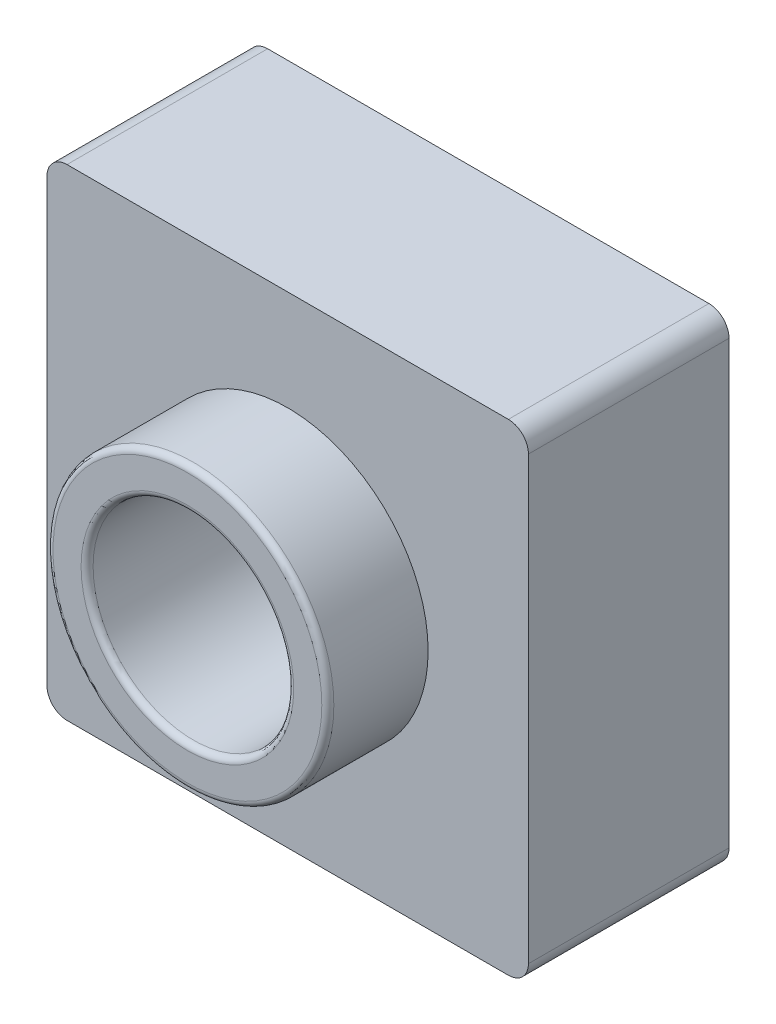
ISO-10303-21;
HEADER;
FILE_DESCRIPTION(('STEP AP214'),'2;1');
FILE_NAME('part.step','',(''),(''),'','','');
FILE_SCHEMA(('AUTOMOTIVE_DESIGN { 1 0 10303 214 1 1 1 1 }'));
ENDSEC;
DATA;
#1=APPLICATION_CONTEXT('core data for automotive mechanical design processes');
#2=APPLICATION_PROTOCOL_DEFINITION('international standard','automotive_design',2000,#1);
#3=PRODUCT_CONTEXT('',#1,'mechanical');
#4=PRODUCT('Part','Part','',(#3));
#5=PRODUCT_RELATED_PRODUCT_CATEGORY('part','',(#4));
#6=PRODUCT_DEFINITION_FORMATION('','',#4);
#7=PRODUCT_DEFINITION_CONTEXT('part definition',#1,'design');
#8=PRODUCT_DEFINITION('design','',#6,#7);
#9=PRODUCT_DEFINITION_SHAPE('','',#8);
#10=(LENGTH_UNIT() NAMED_UNIT(*) SI_UNIT(.MILLI.,.METRE.));
#11=(NAMED_UNIT(*) PLANE_ANGLE_UNIT() SI_UNIT($,.RADIAN.));
#12=(NAMED_UNIT(*) SI_UNIT($,.STERADIAN.) SOLID_ANGLE_UNIT());
#13=UNCERTAINTY_MEASURE_WITH_UNIT(LENGTH_MEASURE(1.E-05),#10,'distance_accuracy_value','');
#14=(GEOMETRIC_REPRESENTATION_CONTEXT(3) GLOBAL_UNCERTAINTY_ASSIGNED_CONTEXT((#13)) GLOBAL_UNIT_ASSIGNED_CONTEXT((#10,
#11,#12)) REPRESENTATION_CONTEXT('',''));
#15=CARTESIAN_POINT('',(0.,0.,0.));
#16=DIRECTION('',(0.,0.,1.));
#17=DIRECTION('',(1.,0.,0.));
#18=AXIS2_PLACEMENT_3D('',#15,#16,#17);
#19=CARTESIAN_POINT('',(-202.772277227723,101.386138613861,50.));
#20=DIRECTION('',(1.,0.,0.));
#21=DIRECTION('',(0.,1.,0.));
#22=AXIS2_PLACEMENT_3D('',#19,#20,#21);
#23=PLANE('',#22);
#24=DIRECTION('',(0.,-1.,0.));
#25=VECTOR('',#24,1.);
#26=CARTESIAN_POINT('',(-202.772277227723,101.386138613861,0.));
#27=LINE('',#26,#25);
#28=CARTESIAN_POINT('',(-202.772277227723,96.3861386138614,0.));
#29=VERTEX_POINT('',#28);
#30=CARTESIAN_POINT('',(-202.772277227723,-13.6138613861386,0.));
#31=VERTEX_POINT('',#30);
#32=EDGE_CURVE('E125',#29,#31,#27,.T.);
#33=ORIENTED_EDGE('',*,*,#32,.T.);
#34=DIRECTION('',(0.,0.,-1.));
#35=VECTOR('',#34,1.);
#36=CARTESIAN_POINT('',(-202.772277227723,-13.6138613861386,50.));
#37=LINE('',#36,#35);
#38=CARTESIAN_POINT('',(-202.772277227723,-13.6138613861386,50.));
#39=VERTEX_POINT('',#38);
#40=EDGE_CURVE('E103',#31,#39,#37,.F.);
#41=ORIENTED_EDGE('',*,*,#40,.T.);
#42=DIRECTION('',(0.,-1.,0.));
#43=VECTOR('',#42,1.);
#44=CARTESIAN_POINT('',(-202.772277227723,101.386138613861,50.));
#45=LINE('',#44,#43);
#46=CARTESIAN_POINT('',(-202.772277227723,96.3861386138614,50.));
#47=VERTEX_POINT('',#46);
#48=EDGE_CURVE('E135',#47,#39,#45,.T.);
#49=ORIENTED_EDGE('',*,*,#48,.F.);
#50=DIRECTION('',(0.,0.,-1.));
#51=VECTOR('',#50,1.);
#52=CARTESIAN_POINT('',(-202.772277227723,96.3861386138614,50.));
#53=LINE('',#52,#51);
#54=EDGE_CURVE('E108',#47,#29,#53,.T.);
#55=ORIENTED_EDGE('',*,*,#54,.T.);
#56=EDGE_LOOP('',(#33,#41,#49,#55));
#57=FACE_BOUND('',#56,.T.);
#58=ADVANCED_FACE('F33',(#57),#23,.F.);
#59=CARTESIAN_POINT('',(-202.772277227723,-18.6138613861386,50.));
#60=DIRECTION('',(0.,1.,0.));
#61=DIRECTION('',(0.,0.,1.));
#62=AXIS2_PLACEMENT_3D('',#59,#60,#61);
#63=PLANE('',#62);
#64=DIRECTION('',(1.,0.,0.));
#65=VECTOR('',#64,1.);
#66=CARTESIAN_POINT('',(-202.772277227723,-18.6138613861386,50.));
#67=LINE('',#66,#65);
#68=CARTESIAN_POINT('',(-197.772277227723,-18.6138613861386,50.));
#69=VERTEX_POINT('',#68);
#70=CARTESIAN_POINT('',(-87.7722772277228,-18.6138613861386,50.));
#71=VERTEX_POINT('',#70);
#72=EDGE_CURVE('E118',#69,#71,#67,.T.);
#73=ORIENTED_EDGE('',*,*,#72,.F.);
#74=DIRECTION('',(0.,0.,-1.));
#75=VECTOR('',#74,1.);
#76=CARTESIAN_POINT('',(-197.772277227723,-18.6138613861386,50.));
#77=LINE('',#76,#75);
#78=CARTESIAN_POINT('',(-197.772277227723,-18.6138613861386,0.));
#79=VERTEX_POINT('',#78);
#80=EDGE_CURVE('E102',#69,#79,#77,.T.);
#81=ORIENTED_EDGE('',*,*,#80,.T.);
#82=DIRECTION('',(1.,0.,0.));
#83=VECTOR('',#82,1.);
#84=CARTESIAN_POINT('',(-202.772277227723,-18.6138613861386,0.));
#85=LINE('',#84,#83);
#86=CARTESIAN_POINT('',(-87.7722772277228,-18.6138613861386,0.));
#87=VERTEX_POINT('',#86);
#88=EDGE_CURVE('E115',#79,#87,#85,.T.);
#89=ORIENTED_EDGE('',*,*,#88,.T.);
#90=DIRECTION('',(0.,0.,-1.));
#91=VECTOR('',#90,1.);
#92=CARTESIAN_POINT('',(-87.7722772277228,-18.6138613861386,50.));
#93=LINE('',#92,#91);
#94=EDGE_CURVE('E120',#87,#71,#93,.F.);
#95=ORIENTED_EDGE('',*,*,#94,.T.);
#96=EDGE_LOOP('',(#73,#81,#89,#95));
#97=FACE_BOUND('',#96,.T.);
#98=ADVANCED_FACE('F114',(#97),#63,.F.);
#99=CARTESIAN_POINT('',(-82.7722772277228,101.386138613861,50.));
#100=DIRECTION('',(-1.,0.,0.));
#101=DIRECTION('',(0.,0.,1.));
#102=AXIS2_PLACEMENT_3D('',#99,#100,#101);
#103=PLANE('',#102);
#104=DIRECTION('',(0.,1.,0.));
#105=VECTOR('',#104,1.);
#106=CARTESIAN_POINT('',(-82.7722772277228,101.386138613861,50.));
#107=LINE('',#106,#105);
#108=CARTESIAN_POINT('',(-82.7722772277228,-13.6138613861386,50.));
#109=VERTEX_POINT('',#108);
#110=CARTESIAN_POINT('',(-82.7722772277228,96.3861386138614,50.));
#111=VERTEX_POINT('',#110);
#112=EDGE_CURVE('E181',#109,#111,#107,.T.);
#113=ORIENTED_EDGE('',*,*,#112,.F.);
#114=DIRECTION('',(0.,0.,-1.));
#115=VECTOR('',#114,1.);
#116=CARTESIAN_POINT('',(-82.7722772277228,-13.6138613861386,50.));
#117=LINE('',#116,#115);
#118=CARTESIAN_POINT('',(-82.7722772277228,-13.6138613861386,0.));
#119=VERTEX_POINT('',#118);
#120=EDGE_CURVE('E166',#109,#119,#117,.T.);
#121=ORIENTED_EDGE('',*,*,#120,.T.);
#122=DIRECTION('',(0.,1.,0.));
#123=VECTOR('',#122,1.);
#124=CARTESIAN_POINT('',(-82.7722772277228,101.386138613861,0.));
#125=LINE('',#124,#123);
#126=CARTESIAN_POINT('',(-82.7722772277228,96.3861386138614,0.));
#127=VERTEX_POINT('',#126);
#128=EDGE_CURVE('E124',#119,#127,#125,.T.);
#129=ORIENTED_EDGE('',*,*,#128,.T.);
#130=DIRECTION('',(0.,0.,-1.));
#131=VECTOR('',#130,1.);
#132=CARTESIAN_POINT('',(-82.7722772277228,96.3861386138614,50.));
#133=LINE('',#132,#131);
#134=EDGE_CURVE('E164',#127,#111,#133,.F.);
#135=ORIENTED_EDGE('',*,*,#134,.T.);
#136=EDGE_LOOP('',(#113,#121,#129,#135));
#137=FACE_BOUND('',#136,.T.);
#138=ADVANCED_FACE('F197',(#137),#103,.F.);
#139=CARTESIAN_POINT('',(-202.772277227723,101.386138613861,50.));
#140=DIRECTION('',(0.,-1.,0.));
#141=DIRECTION('',(0.,0.,-1.));
#142=AXIS2_PLACEMENT_3D('',#139,#140,#141);
#143=PLANE('',#142);
#144=DIRECTION('',(-1.,0.,0.));
#145=VECTOR('',#144,1.);
#146=CARTESIAN_POINT('',(-202.772277227723,101.386138613861,0.));
#147=LINE('',#146,#145);
#148=CARTESIAN_POINT('',(-87.7722772277228,101.386138613861,0.));
#149=VERTEX_POINT('',#148);
#150=CARTESIAN_POINT('',(-197.772277227723,101.386138613861,0.));
#151=VERTEX_POINT('',#150);
#152=EDGE_CURVE('E128',#149,#151,#147,.T.);
#153=ORIENTED_EDGE('',*,*,#152,.T.);
#154=DIRECTION('',(0.,0.,-1.));
#155=VECTOR('',#154,1.);
#156=CARTESIAN_POINT('',(-197.772277227723,101.386138613861,50.));
#157=LINE('',#156,#155);
#158=CARTESIAN_POINT('',(-197.772277227723,101.386138613861,50.));
#159=VERTEX_POINT('',#158);
#160=EDGE_CURVE('E11',#151,#159,#157,.F.);
#161=ORIENTED_EDGE('',*,*,#160,.T.);
#162=DIRECTION('',(-1.,0.,0.));
#163=VECTOR('',#162,1.);
#164=CARTESIAN_POINT('',(-202.772277227723,101.386138613861,50.));
#165=LINE('',#164,#163);
#166=CARTESIAN_POINT('',(-87.7722772277228,101.386138613861,50.));
#167=VERTEX_POINT('',#166);
#168=EDGE_CURVE('E140',#167,#159,#165,.T.);
#169=ORIENTED_EDGE('',*,*,#168,.F.);
#170=DIRECTION('',(0.,0.,-1.));
#171=VECTOR('',#170,1.);
#172=CARTESIAN_POINT('',(-87.7722772277228,101.386138613861,50.));
#173=LINE('',#172,#171);
#174=EDGE_CURVE('E41',#167,#149,#173,.T.);
#175=ORIENTED_EDGE('',*,*,#174,.T.);
#176=EDGE_LOOP('',(#153,#161,#169,#175));
#177=FACE_BOUND('',#176,.T.);
#178=ADVANCED_FACE('F171',(#177),#143,.F.);
#179=CARTESIAN_POINT('',(0.,0.,50.));
#180=DIRECTION('',(0.,0.,1.));
#181=DIRECTION('',(1.,0.,0.));
#182=AXIS2_PLACEMENT_3D('',#179,#180,#181);
#183=PLANE('',#182);
#184=CARTESIAN_POINT('',(-142.772277227723,41.3861386138614,50.));
#185=DIRECTION('',(0.,0.,1.));
#186=DIRECTION('',(1.,0.,0.));
#187=AXIS2_PLACEMENT_3D('',#184,#185,#186);
#188=CIRCLE('',#187,35.);
#189=CARTESIAN_POINT('',(-107.772277227723,41.3861386138614,50.));
#190=VERTEX_POINT('',#189);
#191=EDGE_CURVE('E130',#190,#190,#188,.T.);
#192=ORIENTED_EDGE('',*,*,#191,.F.);
#193=EDGE_LOOP('',(#192));
#194=FACE_BOUND('',#193,.T.);
#195=ORIENTED_EDGE('',*,*,#48,.T.);
#196=CARTESIAN_POINT('',(-197.772277227723,-13.6138613861386,50.));
#197=DIRECTION('',(0.,0.,1.));
#198=DIRECTION('',(1.,0.,0.));
#199=AXIS2_PLACEMENT_3D('',#196,#197,#198);
#200=CIRCLE('',#199,5.);
#201=EDGE_CURVE('E162',#39,#69,#200,.T.);
#202=ORIENTED_EDGE('',*,*,#201,.T.);
#203=ORIENTED_EDGE('',*,*,#72,.T.);
#204=CARTESIAN_POINT('',(-87.7722772277228,-13.6138613861386,50.));
#205=DIRECTION('',(0.,0.,1.));
#206=DIRECTION('',(1.,0.,0.));
#207=AXIS2_PLACEMENT_3D('',#204,#205,#206);
#208=CIRCLE('',#207,5.);
#209=EDGE_CURVE('E160',#71,#109,#208,.T.);
#210=ORIENTED_EDGE('',*,*,#209,.T.);
#211=ORIENTED_EDGE('',*,*,#112,.T.);
#212=CARTESIAN_POINT('',(-87.7722772277228,96.3861386138614,50.));
#213=DIRECTION('',(0.,0.,1.));
#214=DIRECTION('',(1.,0.,0.));
#215=AXIS2_PLACEMENT_3D('',#212,#213,#214);
#216=CIRCLE('',#215,5.);
#217=EDGE_CURVE('E53',#111,#167,#216,.T.);
#218=ORIENTED_EDGE('',*,*,#217,.T.);
#219=ORIENTED_EDGE('',*,*,#168,.T.);
#220=CARTESIAN_POINT('',(-197.772277227723,96.3861386138614,50.));
#221=DIRECTION('',(0.,0.,1.));
#222=DIRECTION('',(1.,0.,0.));
#223=AXIS2_PLACEMENT_3D('',#220,#221,#222);
#224=CIRCLE('',#223,5.);
#225=EDGE_CURVE('E158',#159,#47,#224,.T.);
#226=ORIENTED_EDGE('',*,*,#225,.T.);
#227=EDGE_LOOP('',(#195,#202,#203,#210,#211,#218,#219,#226));
#228=FACE_BOUND('',#227,.T.);
#229=ADVANCED_FACE('F186',(#194,#228),#183,.T.);
#230=CARTESIAN_POINT('',(0.,0.,0.));
#231=DIRECTION('',(0.,0.,1.));
#232=DIRECTION('',(1.,0.,0.));
#233=AXIS2_PLACEMENT_3D('',#230,#231,#232);
#234=PLANE('',#233);
#235=CARTESIAN_POINT('',(-142.772277227723,41.3861386138614,0.));
#236=DIRECTION('',(0.,0.,1.));
#237=DIRECTION('',(1.,0.,0.));
#238=AXIS2_PLACEMENT_3D('',#235,#236,#237);
#239=CIRCLE('',#238,25.);
#240=CARTESIAN_POINT('',(-117.772277227723,41.3861386138614,0.));
#241=VERTEX_POINT('',#240);
#242=EDGE_CURVE('E319',#241,#241,#239,.T.);
#243=ORIENTED_EDGE('',*,*,#242,.T.);
#244=EDGE_LOOP('',(#243));
#245=FACE_BOUND('',#244,.T.);
#246=ORIENTED_EDGE('',*,*,#88,.F.);
#247=CARTESIAN_POINT('',(-197.772277227723,-13.6138613861386,0.));
#248=DIRECTION('',(0.,0.,1.));
#249=DIRECTION('',(1.,0.,0.));
#250=AXIS2_PLACEMENT_3D('',#247,#248,#249);
#251=CIRCLE('',#250,5.);
#252=EDGE_CURVE('E98',#79,#31,#251,.F.);
#253=ORIENTED_EDGE('',*,*,#252,.T.);
#254=ORIENTED_EDGE('',*,*,#32,.F.);
#255=CARTESIAN_POINT('',(-197.772277227723,96.3861386138614,0.));
#256=DIRECTION('',(0.,0.,1.));
#257=DIRECTION('',(1.,0.,0.));
#258=AXIS2_PLACEMENT_3D('',#255,#256,#257);
#259=CIRCLE('',#258,5.);
#260=EDGE_CURVE('E151',#29,#151,#259,.F.);
#261=ORIENTED_EDGE('',*,*,#260,.T.);
#262=ORIENTED_EDGE('',*,*,#152,.F.);
#263=CARTESIAN_POINT('',(-87.7722772277228,96.3861386138614,0.));
#264=DIRECTION('',(0.,0.,1.));
#265=DIRECTION('',(1.,0.,0.));
#266=AXIS2_PLACEMENT_3D('',#263,#264,#265);
#267=CIRCLE('',#266,5.);
#268=EDGE_CURVE('E119',#149,#127,#267,.F.);
#269=ORIENTED_EDGE('',*,*,#268,.T.);
#270=ORIENTED_EDGE('',*,*,#128,.F.);
#271=CARTESIAN_POINT('',(-87.7722772277228,-13.6138613861386,0.));
#272=DIRECTION('',(0.,0.,1.));
#273=DIRECTION('',(1.,0.,0.));
#274=AXIS2_PLACEMENT_3D('',#271,#272,#273);
#275=CIRCLE('',#274,5.);
#276=EDGE_CURVE('E109',#119,#87,#275,.F.);
#277=ORIENTED_EDGE('',*,*,#276,.T.);
#278=EDGE_LOOP('',(#246,#253,#254,#261,#262,#269,#270,#277));
#279=FACE_BOUND('',#278,.T.);
#280=ADVANCED_FACE('F122',(#245,#279),#234,.F.);
#281=CARTESIAN_POINT('',(-142.772277227723,41.3861386138614,75.));
#282=DIRECTION('',(0.,0.,-1.));
#283=DIRECTION('',(-1.,0.,0.));
#284=AXIS2_PLACEMENT_3D('',#281,#282,#283);
#285=CYLINDRICAL_SURFACE('',#284,35.);
#286=CARTESIAN_POINT('',(-142.772277227723,41.3861386138614,73.5));
#287=DIRECTION('',(0.,0.,1.));
#288=DIRECTION('',(1.,0.,0.));
#289=AXIS2_PLACEMENT_3D('',#286,#287,#288);
#290=CIRCLE('',#289,35.);
#291=CARTESIAN_POINT('',(-107.772277227723,41.3861386138614,73.5));
#292=VERTEX_POINT('',#291);
#293=EDGE_CURVE('E143',#292,#292,#290,.F.);
#294=ORIENTED_EDGE('',*,*,#293,.T.);
#295=EDGE_LOOP('',(#294));
#296=FACE_BOUND('',#295,.T.);
#297=ORIENTED_EDGE('',*,*,#191,.T.);
#298=EDGE_LOOP('',(#297));
#299=FACE_BOUND('',#298,.T.);
#300=ADVANCED_FACE('F194',(#296,#299),#285,.T.);
#301=CARTESIAN_POINT('',(-142.772277227723,41.3861386138614,75.));
#302=DIRECTION('',(0.,0.,1.));
#303=DIRECTION('',(1.,0.,0.));
#304=AXIS2_PLACEMENT_3D('',#301,#302,#303);
#305=PLANE('',#304);
#306=CARTESIAN_POINT('',(-142.772277227723,41.3861386138614,75.));
#307=DIRECTION('',(0.,0.,1.));
#308=DIRECTION('',(1.,0.,0.));
#309=AXIS2_PLACEMENT_3D('',#306,#307,#308);
#310=CIRCLE('',#309,33.5);
#311=CARTESIAN_POINT('',(-109.272277227723,41.3861386138614,75.));
#312=VERTEX_POINT('',#311);
#313=EDGE_CURVE('E139',#312,#312,#310,.T.);
#314=ORIENTED_EDGE('',*,*,#313,.T.);
#315=EDGE_LOOP('',(#314));
#316=FACE_BOUND('',#315,.T.);
#317=CARTESIAN_POINT('',(-142.772277227723,41.3861386138614,75.));
#318=DIRECTION('',(0.,0.,1.));
#319=DIRECTION('',(1.,0.,0.));
#320=AXIS2_PLACEMENT_3D('',#317,#318,#319);
#321=CIRCLE('',#320,26.5);
#322=CARTESIAN_POINT('',(-116.272277227723,41.3861386138614,75.));
#323=VERTEX_POINT('',#322);
#324=EDGE_CURVE('E136',#323,#323,#321,.F.);
#325=ORIENTED_EDGE('',*,*,#324,.T.);
#326=EDGE_LOOP('',(#325));
#327=FACE_BOUND('',#326,.T.);
#328=ADVANCED_FACE('F291',(#316,#327),#305,.T.);
#329=CARTESIAN_POINT('',(-142.772277227723,41.3861386138614,0.));
#330=DIRECTION('',(0.,0.,1.));
#331=DIRECTION('',(1.,0.,0.));
#332=AXIS2_PLACEMENT_3D('',#329,#330,#331);
#333=CYLINDRICAL_SURFACE('',#332,25.);
#334=CARTESIAN_POINT('',(-142.772277227723,41.3861386138614,73.5));
#335=DIRECTION('',(0.,0.,1.));
#336=DIRECTION('',(1.,0.,0.));
#337=AXIS2_PLACEMENT_3D('',#334,#335,#336);
#338=CIRCLE('',#337,25.);
#339=CARTESIAN_POINT('',(-117.772277227723,41.3861386138614,73.5));
#340=VERTEX_POINT('',#339);
#341=EDGE_CURVE('E146',#340,#340,#338,.T.);
#342=ORIENTED_EDGE('',*,*,#341,.T.);
#343=EDGE_LOOP('',(#342));
#344=FACE_BOUND('',#343,.T.);
#345=ORIENTED_EDGE('',*,*,#242,.F.);
#346=EDGE_LOOP('',(#345));
#347=FACE_BOUND('',#346,.T.);
#348=ADVANCED_FACE('F213',(#344,#347),#333,.F.);
#349=CARTESIAN_POINT('',(-142.772277227723,41.3861386138614,73.5));
#350=DIRECTION('',(0.,0.,1.));
#351=DIRECTION('',(1.,0.,0.));
#352=AXIS2_PLACEMENT_3D('',#349,#350,#351);
#353=TOROIDAL_SURFACE('',#352,33.5,1.5);
#354=ORIENTED_EDGE('',*,*,#293,.F.);
#355=EDGE_LOOP('',(#354));
#356=FACE_BOUND('',#355,.T.);
#357=ORIENTED_EDGE('',*,*,#313,.F.);
#358=EDGE_LOOP('',(#357));
#359=FACE_BOUND('',#358,.T.);
#360=ADVANCED_FACE('F209',(#356,#359),#353,.T.);
#361=CARTESIAN_POINT('',(-142.772277227723,41.3861386138614,73.5));
#362=DIRECTION('',(0.,0.,1.));
#363=DIRECTION('',(1.,0.,0.));
#364=AXIS2_PLACEMENT_3D('',#361,#362,#363);
#365=TOROIDAL_SURFACE('',#364,26.5,1.5);
#366=ORIENTED_EDGE('',*,*,#324,.F.);
#367=EDGE_LOOP('',(#366));
#368=FACE_BOUND('',#367,.T.);
#369=ORIENTED_EDGE('',*,*,#341,.F.);
#370=EDGE_LOOP('',(#369));
#371=FACE_BOUND('',#370,.T.);
#372=ADVANCED_FACE('F212',(#368,#371),#365,.T.);
#373=CARTESIAN_POINT('',(-197.772277227723,-13.6138613861386,50.));
#374=DIRECTION('',(0.,0.,-1.));
#375=DIRECTION('',(-1.,0.,0.));
#376=AXIS2_PLACEMENT_3D('',#373,#374,#375);
#377=CYLINDRICAL_SURFACE('',#376,5.);
#378=ORIENTED_EDGE('',*,*,#201,.F.);
#379=ORIENTED_EDGE('',*,*,#40,.F.);
#380=ORIENTED_EDGE('',*,*,#252,.F.);
#381=ORIENTED_EDGE('',*,*,#80,.F.);
#382=EDGE_LOOP('',(#378,#379,#380,#381));
#383=FACE_BOUND('',#382,.T.);
#384=ADVANCED_FACE('F101',(#383),#377,.T.);
#385=CARTESIAN_POINT('',(-87.7722772277228,-13.6138613861386,50.));
#386=DIRECTION('',(0.,0.,-1.));
#387=DIRECTION('',(-1.,0.,0.));
#388=AXIS2_PLACEMENT_3D('',#385,#386,#387);
#389=CYLINDRICAL_SURFACE('',#388,5.);
#390=ORIENTED_EDGE('',*,*,#209,.F.);
#391=ORIENTED_EDGE('',*,*,#94,.F.);
#392=ORIENTED_EDGE('',*,*,#276,.F.);
#393=ORIENTED_EDGE('',*,*,#120,.F.);
#394=EDGE_LOOP('',(#390,#391,#392,#393));
#395=FACE_BOUND('',#394,.T.);
#396=ADVANCED_FACE('F220',(#395),#389,.T.);
#397=CARTESIAN_POINT('',(-197.772277227723,96.3861386138614,50.));
#398=DIRECTION('',(0.,0.,-1.));
#399=DIRECTION('',(-1.,0.,0.));
#400=AXIS2_PLACEMENT_3D('',#397,#398,#399);
#401=CYLINDRICAL_SURFACE('',#400,5.);
#402=ORIENTED_EDGE('',*,*,#225,.F.);
#403=ORIENTED_EDGE('',*,*,#160,.F.);
#404=ORIENTED_EDGE('',*,*,#260,.F.);
#405=ORIENTED_EDGE('',*,*,#54,.F.);
#406=EDGE_LOOP('',(#402,#403,#404,#405));
#407=FACE_BOUND('',#406,.T.);
#408=ADVANCED_FACE('F176',(#407),#401,.T.);
#409=CARTESIAN_POINT('',(-87.7722772277228,96.3861386138614,50.));
#410=DIRECTION('',(0.,0.,-1.));
#411=DIRECTION('',(-1.,0.,0.));
#412=AXIS2_PLACEMENT_3D('',#409,#410,#411);
#413=CYLINDRICAL_SURFACE('',#412,5.);
#414=ORIENTED_EDGE('',*,*,#217,.F.);
#415=ORIENTED_EDGE('',*,*,#134,.F.);
#416=ORIENTED_EDGE('',*,*,#268,.F.);
#417=ORIENTED_EDGE('',*,*,#174,.F.);
#418=EDGE_LOOP('',(#414,#415,#416,#417));
#419=FACE_BOUND('',#418,.T.);
#420=ADVANCED_FACE('F35',(#419),#413,.T.);
#421=CLOSED_SHELL('',(#58,#98,#138,#178,#229,#280,#300,#328,#348,#360,#372,#384,#396,#408,#420));
#422=MANIFOLD_SOLID_BREP('B2',#421);
#423=ADVANCED_BREP_SHAPE_REPRESENTATION('',(#18,#422),#14);
#424=SHAPE_DEFINITION_REPRESENTATION(#9,#423);
ENDSEC;
END-ISO-10303-21;
